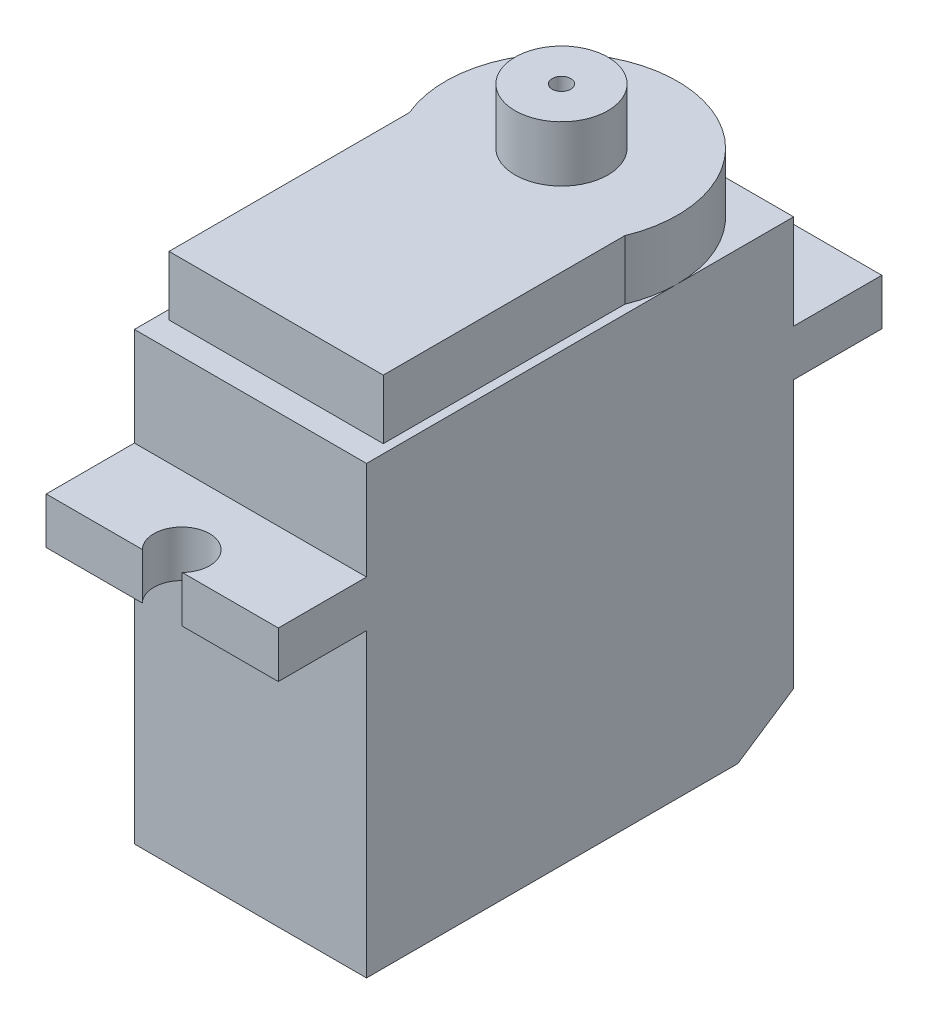
ISO-10303-21;
HEADER;
FILE_DESCRIPTION(('STEP AP214'),'2;1');
FILE_NAME('part.step','',(''),(''),'','','');
FILE_SCHEMA(('AUTOMOTIVE_DESIGN { 1 0 10303 214 1 1 1 1 }'));
ENDSEC;
DATA;
#1=APPLICATION_CONTEXT('core data for automotive mechanical design processes');
#2=APPLICATION_PROTOCOL_DEFINITION('international standard','automotive_design',2000,#1);
#3=PRODUCT_CONTEXT('',#1,'mechanical');
#4=PRODUCT('Part','Part','',(#3));
#5=PRODUCT_RELATED_PRODUCT_CATEGORY('part','',(#4));
#6=PRODUCT_DEFINITION_FORMATION('','',#4);
#7=PRODUCT_DEFINITION_CONTEXT('part definition',#1,'design');
#8=PRODUCT_DEFINITION('design','',#6,#7);
#9=PRODUCT_DEFINITION_SHAPE('','',#8);
#10=(LENGTH_UNIT() NAMED_UNIT(*) SI_UNIT(.MILLI.,.METRE.));
#11=(NAMED_UNIT(*) PLANE_ANGLE_UNIT() SI_UNIT($,.RADIAN.));
#12=(NAMED_UNIT(*) SI_UNIT($,.STERADIAN.) SOLID_ANGLE_UNIT());
#13=UNCERTAINTY_MEASURE_WITH_UNIT(LENGTH_MEASURE(1.E-05),#10,'distance_accuracy_value','');
#14=(GEOMETRIC_REPRESENTATION_CONTEXT(3) GLOBAL_UNCERTAINTY_ASSIGNED_CONTEXT((#13)) GLOBAL_UNIT_ASSIGNED_CONTEXT((#10,
#11,#12)) REPRESENTATION_CONTEXT('',''));
#15=CARTESIAN_POINT('',(0.,0.,0.));
#16=DIRECTION('',(0.,0.,1.));
#17=DIRECTION('',(1.,0.,0.));
#18=AXIS2_PLACEMENT_3D('',#15,#16,#17);
#19=CARTESIAN_POINT('',(0.,0.,-16.25));
#20=DIRECTION('',(0.,0.,-1.));
#21=DIRECTION('',(-1.,0.,0.));
#22=AXIS2_PLACEMENT_3D('',#19,#20,#21);
#23=PLANE('',#22);
#24=DIRECTION('',(0.,1.,0.));
#25=VECTOR('',#24,1.);
#26=CARTESIAN_POINT('',(-1.07121426428143,-0.001000000000001,-16.25));
#27=LINE('',#26,#25);
#28=CARTESIAN_POINT('',(-1.07121426428143,18.9,-16.25));
#29=VERTEX_POINT('',#28);
#30=CARTESIAN_POINT('',(-1.07121426428143,16.4,-16.25));
#31=VERTEX_POINT('',#30);
#32=EDGE_CURVE('E440',#29,#31,#27,.F.);
#33=ORIENTED_EDGE('',*,*,#32,.T.);
#34=DIRECTION('',(-1.,0.,0.));
#35=VECTOR('',#34,1.);
#36=CARTESIAN_POINT('',(6.25,16.4,-16.25));
#37=LINE('',#36,#35);
#38=CARTESIAN_POINT('',(-6.25,16.4,-16.25));
#39=VERTEX_POINT('',#38);
#40=EDGE_CURVE('E381',#31,#39,#37,.T.);
#41=ORIENTED_EDGE('',*,*,#40,.T.);
#42=DIRECTION('',(0.,1.,0.));
#43=VECTOR('',#42,1.);
#44=CARTESIAN_POINT('',(-6.25,18.9,-16.25));
#45=LINE('',#44,#43);
#46=CARTESIAN_POINT('',(-6.25,18.9,-16.25));
#47=VERTEX_POINT('',#46);
#48=EDGE_CURVE('E374',#39,#47,#45,.T.);
#49=ORIENTED_EDGE('',*,*,#48,.T.);
#50=DIRECTION('',(1.,0.,0.));
#51=VECTOR('',#50,1.);
#52=CARTESIAN_POINT('',(6.25,18.9,-16.25));
#53=LINE('',#52,#51);
#54=EDGE_CURVE('E360',#47,#29,#53,.T.);
#55=ORIENTED_EDGE('',*,*,#54,.T.);
#56=EDGE_LOOP('',(#33,#41,#49,#55));
#57=FACE_BOUND('',#56,.T.);
#58=ADVANCED_FACE('F49',(#57),#23,.T.);
#59=CARTESIAN_POINT('',(0.,0.,16.25));
#60=DIRECTION('',(0.,0.,1.));
#61=DIRECTION('',(1.,0.,0.));
#62=AXIS2_PLACEMENT_3D('',#59,#60,#61);
#63=PLANE('',#62);
#64=DIRECTION('',(0.,1.,0.));
#65=VECTOR('',#64,1.);
#66=CARTESIAN_POINT('',(1.07121426428143,-0.001000000000001,16.25));
#67=LINE('',#66,#65);
#68=CARTESIAN_POINT('',(1.07121426428143,18.7,16.25));
#69=VERTEX_POINT('',#68);
#70=CARTESIAN_POINT('',(1.07121426428143,16.2,16.25));
#71=VERTEX_POINT('',#70);
#72=EDGE_CURVE('E427',#69,#71,#67,.F.);
#73=ORIENTED_EDGE('',*,*,#72,.T.);
#74=DIRECTION('',(1.,0.,0.));
#75=VECTOR('',#74,1.);
#76=CARTESIAN_POINT('',(6.25,16.2,16.25));
#77=LINE('',#76,#75);
#78=CARTESIAN_POINT('',(6.25,16.2,16.25));
#79=VERTEX_POINT('',#78);
#80=EDGE_CURVE('E410',#71,#79,#77,.T.);
#81=ORIENTED_EDGE('',*,*,#80,.T.);
#82=DIRECTION('',(0.,1.,0.));
#83=VECTOR('',#82,1.);
#84=CARTESIAN_POINT('',(6.25,16.2,16.25));
#85=LINE('',#84,#83);
#86=CARTESIAN_POINT('',(6.25,18.7,16.25));
#87=VERTEX_POINT('',#86);
#88=EDGE_CURVE('E402',#79,#87,#85,.T.);
#89=ORIENTED_EDGE('',*,*,#88,.T.);
#90=DIRECTION('',(-1.,0.,0.));
#91=VECTOR('',#90,1.);
#92=CARTESIAN_POINT('',(6.25,18.7,16.25));
#93=LINE('',#92,#91);
#94=EDGE_CURVE('E414',#87,#69,#93,.T.);
#95=ORIENTED_EDGE('',*,*,#94,.T.);
#96=EDGE_LOOP('',(#73,#81,#89,#95));
#97=FACE_BOUND('',#96,.T.);
#98=ADVANCED_FACE('F528',(#97),#63,.T.);
#99=CARTESIAN_POINT('',(-6.25,24.,11.5));
#100=DIRECTION('',(0.,0.,-1.));
#101=DIRECTION('',(-1.,0.,0.));
#102=AXIS2_PLACEMENT_3D('',#99,#100,#101);
#103=PLANE('',#102);
#104=DIRECTION('',(1.,0.,0.));
#105=VECTOR('',#104,1.);
#106=CARTESIAN_POINT('',(6.25,16.2,11.5));
#107=LINE('',#106,#105);
#108=CARTESIAN_POINT('',(-6.25,16.2,11.5));
#109=VERTEX_POINT('',#108);
#110=CARTESIAN_POINT('',(6.25,16.2,11.5));
#111=VERTEX_POINT('',#110);
#112=EDGE_CURVE('E267',#109,#111,#107,.T.);
#113=ORIENTED_EDGE('',*,*,#112,.F.);
#114=DIRECTION('',(0.,-1.,0.));
#115=VECTOR('',#114,1.);
#116=CARTESIAN_POINT('',(-6.25,24.,11.5));
#117=LINE('',#116,#115);
#118=CARTESIAN_POINT('',(-6.25,0.,11.5));
#119=VERTEX_POINT('',#118);
#120=EDGE_CURVE('E244',#109,#119,#117,.T.);
#121=ORIENTED_EDGE('',*,*,#120,.T.);
#122=DIRECTION('',(1.,0.,0.));
#123=VECTOR('',#122,1.);
#124=CARTESIAN_POINT('',(-6.25,0.,11.5));
#125=LINE('',#124,#123);
#126=CARTESIAN_POINT('',(6.25,0.,11.5));
#127=VERTEX_POINT('',#126);
#128=EDGE_CURVE('E264',#119,#127,#125,.T.);
#129=ORIENTED_EDGE('',*,*,#128,.T.);
#130=DIRECTION('',(0.,-1.,0.));
#131=VECTOR('',#130,1.);
#132=CARTESIAN_POINT('',(6.25,24.,11.5));
#133=LINE('',#132,#131);
#134=EDGE_CURVE('E240',#111,#127,#133,.T.);
#135=ORIENTED_EDGE('',*,*,#134,.F.);
#136=EDGE_LOOP('',(#113,#121,#129,#135));
#137=FACE_BOUND('',#136,.T.);
#138=ADVANCED_FACE('F263',(#137),#103,.F.);
#139=DIRECTION('',(-1.,0.,0.));
#140=VECTOR('',#139,1.);
#141=CARTESIAN_POINT('',(6.25,18.7,11.5));
#142=LINE('',#141,#140);
#143=CARTESIAN_POINT('',(6.25,18.7,11.5));
#144=VERTEX_POINT('',#143);
#145=CARTESIAN_POINT('',(-6.25,18.7,11.5));
#146=VERTEX_POINT('',#145);
#147=EDGE_CURVE('E403',#144,#146,#142,.T.);
#148=ORIENTED_EDGE('',*,*,#147,.F.);
#149=CARTESIAN_POINT('',(6.25,24.,11.5));
#150=VERTEX_POINT('',#149);
#151=EDGE_CURVE('E241',#150,#144,#133,.T.);
#152=ORIENTED_EDGE('',*,*,#151,.F.);
#153=DIRECTION('',(1.,0.,0.));
#154=VECTOR('',#153,1.);
#155=CARTESIAN_POINT('',(-6.25,24.,11.5));
#156=LINE('',#155,#154);
#157=CARTESIAN_POINT('',(-6.25,24.,11.5));
#158=VERTEX_POINT('',#157);
#159=EDGE_CURVE('E286',#158,#150,#156,.T.);
#160=ORIENTED_EDGE('',*,*,#159,.F.);
#161=EDGE_CURVE('E245',#158,#146,#117,.T.);
#162=ORIENTED_EDGE('',*,*,#161,.T.);
#163=EDGE_LOOP('',(#148,#152,#160,#162));
#164=FACE_BOUND('',#163,.T.);
#165=ADVANCED_FACE('F643',(#164),#103,.F.);
#166=CARTESIAN_POINT('',(-6.25,24.,-11.5));
#167=DIRECTION('',(0.,0.,1.));
#168=DIRECTION('',(1.,0.,0.));
#169=AXIS2_PLACEMENT_3D('',#166,#167,#168);
#170=PLANE('',#169);
#171=DIRECTION('',(0.,-1.,0.));
#172=VECTOR('',#171,1.);
#173=CARTESIAN_POINT('',(6.25,24.,-11.5));
#174=LINE('',#173,#172);
#175=CARTESIAN_POINT('',(6.25,16.4,-11.5));
#176=VERTEX_POINT('',#175);
#177=CARTESIAN_POINT('',(6.25,2.,-11.5));
#178=VERTEX_POINT('',#177);
#179=EDGE_CURVE('E216',#176,#178,#174,.T.);
#180=ORIENTED_EDGE('',*,*,#179,.T.);
#181=DIRECTION('',(1.,0.,0.));
#182=VECTOR('',#181,1.);
#183=CARTESIAN_POINT('',(-6.25000000000001,2.,-11.5));
#184=LINE('',#183,#182);
#185=CARTESIAN_POINT('',(-6.25000000000001,2.,-11.5));
#186=VERTEX_POINT('',#185);
#187=EDGE_CURVE('E203',#186,#178,#184,.T.);
#188=ORIENTED_EDGE('',*,*,#187,.F.);
#189=DIRECTION('',(0.,-1.,0.));
#190=VECTOR('',#189,1.);
#191=CARTESIAN_POINT('',(-6.25,24.,-11.5));
#192=LINE('',#191,#190);
#193=CARTESIAN_POINT('',(-6.25,16.4,-11.5));
#194=VERTEX_POINT('',#193);
#195=EDGE_CURVE('E213',#194,#186,#192,.T.);
#196=ORIENTED_EDGE('',*,*,#195,.F.);
#197=DIRECTION('',(-1.,0.,0.));
#198=VECTOR('',#197,1.);
#199=CARTESIAN_POINT('',(6.25,16.4,-11.5));
#200=LINE('',#199,#198);
#201=EDGE_CURVE('E366',#176,#194,#200,.T.);
#202=ORIENTED_EDGE('',*,*,#201,.F.);
#203=EDGE_LOOP('',(#180,#188,#196,#202));
#204=FACE_BOUND('',#203,.T.);
#205=ADVANCED_FACE('F212',(#204),#170,.F.);
#206=DIRECTION('',(1.,0.,0.));
#207=VECTOR('',#206,1.);
#208=CARTESIAN_POINT('',(6.25,18.9,-11.5));
#209=LINE('',#208,#207);
#210=CARTESIAN_POINT('',(-6.25,18.9,-11.5));
#211=VERTEX_POINT('',#210);
#212=CARTESIAN_POINT('',(6.25,18.9,-11.5));
#213=VERTEX_POINT('',#212);
#214=EDGE_CURVE('E361',#211,#213,#209,.T.);
#215=ORIENTED_EDGE('',*,*,#214,.F.);
#216=CARTESIAN_POINT('',(-6.25,24.,-11.5));
#217=VERTEX_POINT('',#216);
#218=EDGE_CURVE('E224',#217,#211,#192,.T.);
#219=ORIENTED_EDGE('',*,*,#218,.F.);
#220=DIRECTION('',(-1.,0.,0.));
#221=VECTOR('',#220,1.);
#222=CARTESIAN_POINT('',(-6.25,24.,-11.5));
#223=LINE('',#222,#221);
#224=CARTESIAN_POINT('',(0.,24.,-11.5));
#225=VERTEX_POINT('',#224);
#226=EDGE_CURVE('E231',#225,#217,#223,.T.);
#227=ORIENTED_EDGE('',*,*,#226,.F.);
#228=CARTESIAN_POINT('',(6.25,24.,-11.5));
#229=VERTEX_POINT('',#228);
#230=EDGE_CURVE('E225',#229,#225,#223,.T.);
#231=ORIENTED_EDGE('',*,*,#230,.F.);
#232=EDGE_CURVE('E237',#229,#213,#174,.T.);
#233=ORIENTED_EDGE('',*,*,#232,.T.);
#234=EDGE_LOOP('',(#215,#219,#227,#231,#233));
#235=FACE_BOUND('',#234,.T.);
#236=ADVANCED_FACE('F478',(#235),#170,.F.);
#237=CARTESIAN_POINT('',(0.,24.,0.));
#238=DIRECTION('',(0.,1.,0.));
#239=DIRECTION('',(0.,0.,1.));
#240=AXIS2_PLACEMENT_3D('',#237,#238,#239);
#241=PLANE('',#240);
#242=CARTESIAN_POINT('',(0.,24.,-5.24999999999999));
#243=DIRECTION('',(0.,1.,0.));
#244=DIRECTION('',(0.,0.,1.));
#245=AXIS2_PLACEMENT_3D('',#242,#243,#244);
#246=CIRCLE('',#245,6.25);
#247=CARTESIAN_POINT('',(5.78168855170607,24.,-2.87627350120722));
#248=VERTEX_POINT('',#247);
#249=CARTESIAN_POINT('',(6.25,24.,-5.25));
#250=VERTEX_POINT('',#249);
#251=EDGE_CURVE('E257',#248,#250,#246,.T.);
#252=ORIENTED_EDGE('',*,*,#251,.F.);
#253=DIRECTION('',(0.,0.,1.));
#254=VECTOR('',#253,1.);
#255=CARTESIAN_POINT('',(5.78168855170607,24.,-2.87627350120722));
#256=LINE('',#255,#254);
#257=CARTESIAN_POINT('',(5.78168855170607,24.,10.1288199195989));
#258=VERTEX_POINT('',#257);
#259=EDGE_CURVE('E320',#248,#258,#256,.T.);
#260=ORIENTED_EDGE('',*,*,#259,.T.);
#261=DIRECTION('',(1.,0.,0.));
#262=VECTOR('',#261,1.);
#263=CARTESIAN_POINT('',(-5.75762102355062,24.,10.1288199195989));
#264=LINE('',#263,#262);
#265=CARTESIAN_POINT('',(-5.75762102355062,24.,10.1288199195989));
#266=VERTEX_POINT('',#265);
#267=EDGE_CURVE('E316',#266,#258,#264,.T.);
#268=ORIENTED_EDGE('',*,*,#267,.F.);
#269=DIRECTION('',(0.,0.,1.));
#270=VECTOR('',#269,1.);
#271=CARTESIAN_POINT('',(-5.75762102355062,24.,-2.81847781232252));
#272=LINE('',#271,#270);
#273=CARTESIAN_POINT('',(-5.75762102355063,24.,-2.81847781232252));
#274=VERTEX_POINT('',#273);
#275=EDGE_CURVE('E312',#274,#266,#272,.T.);
#276=ORIENTED_EDGE('',*,*,#275,.F.);
#277=CARTESIAN_POINT('',(-6.25,24.,-5.24999999999999));
#278=VERTEX_POINT('',#277);
#279=EDGE_CURVE('E247',#278,#274,#246,.T.);
#280=ORIENTED_EDGE('',*,*,#279,.F.);
#281=DIRECTION('',(0.,0.,1.));
#282=VECTOR('',#281,1.);
#283=CARTESIAN_POINT('',(-6.25,24.,-11.5));
#284=LINE('',#283,#282);
#285=EDGE_CURVE('E277',#278,#158,#284,.T.);
#286=ORIENTED_EDGE('',*,*,#285,.T.);
#287=ORIENTED_EDGE('',*,*,#159,.T.);
#288=DIRECTION('',(0.,0.,-1.));
#289=VECTOR('',#288,1.);
#290=CARTESIAN_POINT('',(6.25,24.,-11.5));
#291=LINE('',#290,#289);
#292=EDGE_CURVE('E281',#150,#250,#291,.T.);
#293=ORIENTED_EDGE('',*,*,#292,.T.);
#294=EDGE_LOOP('',(#252,#260,#268,#276,#280,#286,#287,#293));
#295=FACE_BOUND('',#294,.T.);
#296=ADVANCED_FACE('F485',(#295),#241,.T.);
#297=EDGE_CURVE('E58',#250,#225,#246,.T.);
#298=ORIENTED_EDGE('',*,*,#297,.F.);
#299=EDGE_CURVE('E285',#250,#229,#291,.T.);
#300=ORIENTED_EDGE('',*,*,#299,.T.);
#301=ORIENTED_EDGE('',*,*,#230,.T.);
#302=EDGE_LOOP('',(#298,#300,#301));
#303=FACE_BOUND('',#302,.T.);
#304=ADVANCED_FACE('F515',(#303),#241,.T.);
#305=CARTESIAN_POINT('',(-6.25,24.,-11.5));
#306=DIRECTION('',(1.,0.,0.));
#307=DIRECTION('',(0.,0.,-1.));
#308=AXIS2_PLACEMENT_3D('',#305,#306,#307);
#309=PLANE('',#308);
#310=ORIENTED_EDGE('',*,*,#195,.T.);
#311=DIRECTION('',(0.,-0.554700196225229,0.832050294337844));
#312=VECTOR('',#311,1.);
#313=CARTESIAN_POINT('',(-6.25000000000001,2.,-11.5));
#314=LINE('',#313,#312);
#315=CARTESIAN_POINT('',(-6.25000000000001,0.,-8.49999999999999));
#316=VERTEX_POINT('',#315);
#317=EDGE_CURVE('E200',#186,#316,#314,.T.);
#318=ORIENTED_EDGE('',*,*,#317,.T.);
#319=DIRECTION('',(0.,0.,1.));
#320=VECTOR('',#319,1.);
#321=CARTESIAN_POINT('',(-6.25,0.,-11.5));
#322=LINE('',#321,#320);
#323=EDGE_CURVE('E272',#316,#119,#322,.T.);
#324=ORIENTED_EDGE('',*,*,#323,.T.);
#325=ORIENTED_EDGE('',*,*,#120,.F.);
#326=DIRECTION('',(0.,0.,-1.));
#327=VECTOR('',#326,1.);
#328=CARTESIAN_POINT('',(-6.25,16.2,16.25));
#329=LINE('',#328,#327);
#330=CARTESIAN_POINT('',(-6.25,16.2,16.25));
#331=VERTEX_POINT('',#330);
#332=EDGE_CURVE('E392',#331,#109,#329,.T.);
#333=ORIENTED_EDGE('',*,*,#332,.F.);
#334=DIRECTION('',(0.,-1.,0.));
#335=VECTOR('',#334,1.);
#336=CARTESIAN_POINT('',(-6.25,16.2,16.25));
#337=LINE('',#336,#335);
#338=CARTESIAN_POINT('',(-6.25,18.7,16.25));
#339=VERTEX_POINT('',#338);
#340=EDGE_CURVE('E411',#339,#331,#337,.T.);
#341=ORIENTED_EDGE('',*,*,#340,.F.);
#342=DIRECTION('',(0.,0.,-1.));
#343=VECTOR('',#342,1.);
#344=CARTESIAN_POINT('',(-6.25,18.7,16.25));
#345=LINE('',#344,#343);
#346=EDGE_CURVE('E388',#339,#146,#345,.T.);
#347=ORIENTED_EDGE('',*,*,#346,.T.);
#348=ORIENTED_EDGE('',*,*,#161,.F.);
#349=ORIENTED_EDGE('',*,*,#285,.F.);
#350=EDGE_CURVE('E289',#217,#278,#284,.T.);
#351=ORIENTED_EDGE('',*,*,#350,.F.);
#352=ORIENTED_EDGE('',*,*,#218,.T.);
#353=DIRECTION('',(0.,0.,1.));
#354=VECTOR('',#353,1.);
#355=CARTESIAN_POINT('',(-6.25,18.9,-16.25));
#356=LINE('',#355,#354);
#357=EDGE_CURVE('E352',#47,#211,#356,.T.);
#358=ORIENTED_EDGE('',*,*,#357,.F.);
#359=ORIENTED_EDGE('',*,*,#48,.F.);
#360=DIRECTION('',(0.,0.,1.));
#361=VECTOR('',#360,1.);
#362=CARTESIAN_POINT('',(-6.25,16.4,-16.25));
#363=LINE('',#362,#361);
#364=EDGE_CURVE('E222',#39,#194,#363,.T.);
#365=ORIENTED_EDGE('',*,*,#364,.T.);
#366=EDGE_LOOP('',(#310,#318,#324,#325,#333,#341,#347,#348,#349,#351,#352,#358,#359,#365));
#367=FACE_BOUND('',#366,.T.);
#368=ADVANCED_FACE('F51',(#367),#309,.F.);
#369=CARTESIAN_POINT('',(6.25,24.,-11.5));
#370=DIRECTION('',(-1.,0.,0.));
#371=DIRECTION('',(0.,0.,1.));
#372=AXIS2_PLACEMENT_3D('',#369,#370,#371);
#373=PLANE('',#372);
#374=DIRECTION('',(0.,0.,-1.));
#375=VECTOR('',#374,1.);
#376=CARTESIAN_POINT('',(6.25,0.,-11.5));
#377=LINE('',#376,#375);
#378=CARTESIAN_POINT('',(6.25,0.,-8.49999999999999));
#379=VERTEX_POINT('',#378);
#380=EDGE_CURVE('E235',#127,#379,#377,.T.);
#381=ORIENTED_EDGE('',*,*,#380,.T.);
#382=DIRECTION('',(0.,-0.554700196225229,0.832050294337844));
#383=VECTOR('',#382,1.);
#384=CARTESIAN_POINT('',(6.25,2.,-11.5));
#385=LINE('',#384,#383);
#386=EDGE_CURVE('E65',#178,#379,#385,.T.);
#387=ORIENTED_EDGE('',*,*,#386,.F.);
#388=ORIENTED_EDGE('',*,*,#179,.F.);
#389=DIRECTION('',(0.,0.,1.));
#390=VECTOR('',#389,1.);
#391=CARTESIAN_POINT('',(6.25,16.4,-16.25));
#392=LINE('',#391,#390);
#393=CARTESIAN_POINT('',(6.25,16.4,-16.25));
#394=VERTEX_POINT('',#393);
#395=EDGE_CURVE('E346',#394,#176,#392,.T.);
#396=ORIENTED_EDGE('',*,*,#395,.F.);
#397=DIRECTION('',(0.,-1.,0.));
#398=VECTOR('',#397,1.);
#399=CARTESIAN_POINT('',(6.25,18.9,-16.25));
#400=LINE('',#399,#398);
#401=CARTESIAN_POINT('',(6.25,18.9,-16.25));
#402=VERTEX_POINT('',#401);
#403=EDGE_CURVE('E365',#402,#394,#400,.T.);
#404=ORIENTED_EDGE('',*,*,#403,.F.);
#405=DIRECTION('',(0.,0.,1.));
#406=VECTOR('',#405,1.);
#407=CARTESIAN_POINT('',(6.25,18.9,-16.25));
#408=LINE('',#407,#406);
#409=EDGE_CURVE('E356',#402,#213,#408,.T.);
#410=ORIENTED_EDGE('',*,*,#409,.T.);
#411=ORIENTED_EDGE('',*,*,#232,.F.);
#412=ORIENTED_EDGE('',*,*,#299,.F.);
#413=ORIENTED_EDGE('',*,*,#292,.F.);
#414=ORIENTED_EDGE('',*,*,#151,.T.);
#415=DIRECTION('',(0.,0.,-1.));
#416=VECTOR('',#415,1.);
#417=CARTESIAN_POINT('',(6.25,18.7,16.25));
#418=LINE('',#417,#416);
#419=EDGE_CURVE('E369',#87,#144,#418,.T.);
#420=ORIENTED_EDGE('',*,*,#419,.F.);
#421=ORIENTED_EDGE('',*,*,#88,.F.);
#422=DIRECTION('',(0.,0.,-1.));
#423=VECTOR('',#422,1.);
#424=CARTESIAN_POINT('',(6.25,16.2,16.25));
#425=LINE('',#424,#423);
#426=EDGE_CURVE('E395',#79,#111,#425,.T.);
#427=ORIENTED_EDGE('',*,*,#426,.T.);
#428=ORIENTED_EDGE('',*,*,#134,.T.);
#429=EDGE_LOOP('',(#381,#387,#388,#396,#404,#410,#411,#412,#413,#414,#420,#421,#427,#428));
#430=FACE_BOUND('',#429,.T.);
#431=ADVANCED_FACE('F464',(#430),#373,.F.);
#432=EDGE_CURVE('E255',#225,#278,#246,.T.);
#433=ORIENTED_EDGE('',*,*,#432,.F.);
#434=ORIENTED_EDGE('',*,*,#226,.T.);
#435=ORIENTED_EDGE('',*,*,#350,.T.);
#436=EDGE_LOOP('',(#433,#434,#435));
#437=FACE_BOUND('',#436,.T.);
#438=ADVANCED_FACE('F509',(#437),#241,.T.);
#439=CARTESIAN_POINT('',(0.,0.,0.));
#440=DIRECTION('',(0.,1.,0.));
#441=DIRECTION('',(0.,0.,1.));
#442=AXIS2_PLACEMENT_3D('',#439,#440,#441);
#443=PLANE('',#442);
#444=ORIENTED_EDGE('',*,*,#323,.F.);
#445=DIRECTION('',(1.,0.,0.));
#446=VECTOR('',#445,1.);
#447=CARTESIAN_POINT('',(-6.25000000000001,0.,-8.49999999999999));
#448=LINE('',#447,#446);
#449=EDGE_CURVE('E204',#316,#379,#448,.T.);
#450=ORIENTED_EDGE('',*,*,#449,.T.);
#451=ORIENTED_EDGE('',*,*,#380,.F.);
#452=ORIENTED_EDGE('',*,*,#128,.F.);
#453=EDGE_LOOP('',(#444,#450,#451,#452));
#454=FACE_BOUND('',#453,.T.);
#455=ADVANCED_FACE('F271',(#454),#443,.F.);
#456=CARTESIAN_POINT('',(5.78168855170607,27.2,-2.87627350120722));
#457=DIRECTION('',(1.,0.,0.));
#458=DIRECTION('',(0.,0.,-1.));
#459=AXIS2_PLACEMENT_3D('',#456,#457,#458);
#460=PLANE('',#459);
#461=ORIENTED_EDGE('',*,*,#259,.F.);
#462=DIRECTION('',(0.,-1.,0.));
#463=VECTOR('',#462,1.);
#464=CARTESIAN_POINT('',(5.78168855170607,27.2,-2.87627350120722));
#465=LINE('',#464,#463);
#466=CARTESIAN_POINT('',(5.78168855170607,27.2,-2.87627350120722));
#467=VERTEX_POINT('',#466);
#468=EDGE_CURVE('E278',#467,#248,#465,.T.);
#469=ORIENTED_EDGE('',*,*,#468,.F.);
#470=DIRECTION('',(0.,0.,1.));
#471=VECTOR('',#470,1.);
#472=CARTESIAN_POINT('',(5.78168855170607,27.2,-2.87627350120722));
#473=LINE('',#472,#471);
#474=CARTESIAN_POINT('',(5.78168855170607,27.2,10.1288199195989));
#475=VERTEX_POINT('',#474);
#476=EDGE_CURVE('E311',#467,#475,#473,.T.);
#477=ORIENTED_EDGE('',*,*,#476,.T.);
#478=DIRECTION('',(0.,-1.,0.));
#479=VECTOR('',#478,1.);
#480=CARTESIAN_POINT('',(5.78168855170607,27.2,10.1288199195989));
#481=LINE('',#480,#479);
#482=EDGE_CURVE('E293',#475,#258,#481,.T.);
#483=ORIENTED_EDGE('',*,*,#482,.T.);
#484=EDGE_LOOP('',(#461,#469,#477,#483));
#485=FACE_BOUND('',#484,.T.);
#486=ADVANCED_FACE('F496',(#485),#460,.T.);
#487=CARTESIAN_POINT('',(0.,27.2,-5.24999999999999));
#488=DIRECTION('',(0.,-1.,0.));
#489=DIRECTION('',(0.,0.,-1.));
#490=AXIS2_PLACEMENT_3D('',#487,#488,#489);
#491=CYLINDRICAL_SURFACE('',#490,6.25);
#492=ORIENTED_EDGE('',*,*,#251,.T.);
#493=ORIENTED_EDGE('',*,*,#297,.T.);
#494=ORIENTED_EDGE('',*,*,#432,.T.);
#495=ORIENTED_EDGE('',*,*,#279,.T.);
#496=DIRECTION('',(0.,-1.,0.));
#497=VECTOR('',#496,1.);
#498=CARTESIAN_POINT('',(-5.75762102355063,27.2,-2.81847781232252));
#499=LINE('',#498,#497);
#500=CARTESIAN_POINT('',(-5.75762102355063,27.2,-2.81847781232252));
#501=VERTEX_POINT('',#500);
#502=EDGE_CURVE('E302',#501,#274,#499,.T.);
#503=ORIENTED_EDGE('',*,*,#502,.F.);
#504=CARTESIAN_POINT('',(0.,27.2,-5.24999999999999));
#505=DIRECTION('',(0.,1.,0.));
#506=DIRECTION('',(0.,0.,1.));
#507=AXIS2_PLACEMENT_3D('',#504,#505,#506);
#508=CIRCLE('',#507,6.25);
#509=EDGE_CURVE('E298',#467,#501,#508,.T.);
#510=ORIENTED_EDGE('',*,*,#509,.F.);
#511=ORIENTED_EDGE('',*,*,#468,.T.);
#512=EDGE_LOOP('',(#492,#493,#494,#495,#503,#510,#511));
#513=FACE_BOUND('',#512,.T.);
#514=ADVANCED_FACE('F489',(#513),#491,.T.);
#515=CARTESIAN_POINT('',(-5.75762102355062,27.2,-2.81847781232252));
#516=DIRECTION('',(1.,0.,0.));
#517=DIRECTION('',(0.,0.,-1.));
#518=AXIS2_PLACEMENT_3D('',#515,#516,#517);
#519=PLANE('',#518);
#520=ORIENTED_EDGE('',*,*,#275,.T.);
#521=DIRECTION('',(0.,-1.,0.));
#522=VECTOR('',#521,1.);
#523=CARTESIAN_POINT('',(-5.75762102355062,27.2,10.1288199195989));
#524=LINE('',#523,#522);
#525=CARTESIAN_POINT('',(-5.75762102355062,27.2,10.1288199195989));
#526=VERTEX_POINT('',#525);
#527=EDGE_CURVE('E297',#526,#266,#524,.T.);
#528=ORIENTED_EDGE('',*,*,#527,.F.);
#529=DIRECTION('',(0.,0.,1.));
#530=VECTOR('',#529,1.);
#531=CARTESIAN_POINT('',(-5.75762102355062,27.2,-2.81847781232252));
#532=LINE('',#531,#530);
#533=EDGE_CURVE('E326',#501,#526,#532,.T.);
#534=ORIENTED_EDGE('',*,*,#533,.F.);
#535=ORIENTED_EDGE('',*,*,#502,.T.);
#536=EDGE_LOOP('',(#520,#528,#534,#535));
#537=FACE_BOUND('',#536,.T.);
#538=ADVANCED_FACE('F501',(#537),#519,.F.);
#539=CARTESIAN_POINT('',(-5.75762102355062,27.2,10.1288199195989));
#540=DIRECTION('',(0.,0.,-1.));
#541=DIRECTION('',(-1.,0.,0.));
#542=AXIS2_PLACEMENT_3D('',#539,#540,#541);
#543=PLANE('',#542);
#544=ORIENTED_EDGE('',*,*,#267,.T.);
#545=ORIENTED_EDGE('',*,*,#482,.F.);
#546=DIRECTION('',(1.,0.,0.));
#547=VECTOR('',#546,1.);
#548=CARTESIAN_POINT('',(-5.75762102355062,27.2,10.1288199195989));
#549=LINE('',#548,#547);
#550=EDGE_CURVE('E329',#526,#475,#549,.T.);
#551=ORIENTED_EDGE('',*,*,#550,.F.);
#552=ORIENTED_EDGE('',*,*,#527,.T.);
#553=EDGE_LOOP('',(#544,#545,#551,#552));
#554=FACE_BOUND('',#553,.T.);
#555=ADVANCED_FACE('F504',(#554),#543,.F.);
#556=CARTESIAN_POINT('',(0.,27.2,-5.24999999999999));
#557=DIRECTION('',(0.,1.,0.));
#558=DIRECTION('',(0.,0.,1.));
#559=AXIS2_PLACEMENT_3D('',#556,#557,#558);
#560=PLANE('',#559);
#561=CARTESIAN_POINT('',(0.,27.2,-5.24999999999999));
#562=DIRECTION('',(0.,1.,0.));
#563=DIRECTION('',(0.,0.,1.));
#564=AXIS2_PLACEMENT_3D('',#561,#562,#563);
#565=CIRCLE('',#564,2.5);
#566=CARTESIAN_POINT('',(0.,27.2,-2.74999999999999));
#567=VERTEX_POINT('',#566);
#568=EDGE_CURVE('E335',#567,#567,#565,.T.);
#569=ORIENTED_EDGE('',*,*,#568,.F.);
#570=EDGE_LOOP('',(#569));
#571=FACE_BOUND('',#570,.T.);
#572=ORIENTED_EDGE('',*,*,#476,.F.);
#573=ORIENTED_EDGE('',*,*,#509,.T.);
#574=ORIENTED_EDGE('',*,*,#533,.T.);
#575=ORIENTED_EDGE('',*,*,#550,.T.);
#576=EDGE_LOOP('',(#572,#573,#574,#575));
#577=FACE_BOUND('',#576,.T.);
#578=ADVANCED_FACE('F506',(#571,#577),#560,.T.);
#579=CARTESIAN_POINT('',(0.,30.2,-5.24999999999999));
#580=DIRECTION('',(0.,1.,0.));
#581=DIRECTION('',(0.,0.,1.));
#582=AXIS2_PLACEMENT_3D('',#579,#580,#581);
#583=PLANE('',#582);
#584=CARTESIAN_POINT('',(0.,30.2,-5.24999999999999));
#585=DIRECTION('',(0.,1.,0.));
#586=DIRECTION('',(0.,0.,1.));
#587=AXIS2_PLACEMENT_3D('',#584,#585,#586);
#588=CIRCLE('',#587,2.5);
#589=CARTESIAN_POINT('',(0.,30.2,-2.74999999999999));
#590=VERTEX_POINT('',#589);
#591=EDGE_CURVE('E323',#590,#590,#588,.T.);
#592=ORIENTED_EDGE('',*,*,#591,.T.);
#593=EDGE_LOOP('',(#592));
#594=FACE_BOUND('',#593,.T.);
#595=CARTESIAN_POINT('',(0.,30.2,-5.24999999999999));
#596=DIRECTION('',(0.,1.,0.));
#597=DIRECTION('',(0.,0.,1.));
#598=AXIS2_PLACEMENT_3D('',#595,#596,#597);
#599=CIRCLE('',#598,0.5);
#600=CARTESIAN_POINT('',(0.,30.2,-4.74999999999999));
#601=VERTEX_POINT('',#600);
#602=EDGE_CURVE('E339',#601,#601,#599,.T.);
#603=ORIENTED_EDGE('',*,*,#602,.F.);
#604=EDGE_LOOP('',(#603));
#605=FACE_BOUND('',#604,.T.);
#606=ADVANCED_FACE('F560',(#594,#605),#583,.T.);
#607=CARTESIAN_POINT('',(0.,30.2,-5.24999999999999));
#608=DIRECTION('',(0.,-1.,0.));
#609=DIRECTION('',(0.,0.,-1.));
#610=AXIS2_PLACEMENT_3D('',#607,#608,#609);
#611=CYLINDRICAL_SURFACE('',#610,2.5);
#612=ORIENTED_EDGE('',*,*,#591,.F.);
#613=EDGE_LOOP('',(#612));
#614=FACE_BOUND('',#613,.T.);
#615=ORIENTED_EDGE('',*,*,#568,.T.);
#616=EDGE_LOOP('',(#615));
#617=FACE_BOUND('',#616,.T.);
#618=ADVANCED_FACE('F558',(#614,#617),#611,.T.);
#619=CARTESIAN_POINT('',(0.,30.2,-5.24999999999999));
#620=DIRECTION('',(0.,-1.,0.));
#621=DIRECTION('',(0.,0.,-1.));
#622=AXIS2_PLACEMENT_3D('',#619,#620,#621);
#623=CYLINDRICAL_SURFACE('',#622,0.5);
#624=ORIENTED_EDGE('',*,*,#602,.T.);
#625=EDGE_LOOP('',(#624));
#626=FACE_BOUND('',#625,.T.);
#627=CARTESIAN_POINT('',(0.,27.2,-5.24999999999999));
#628=DIRECTION('',(0.,1.,0.));
#629=DIRECTION('',(0.,0.,1.));
#630=AXIS2_PLACEMENT_3D('',#627,#628,#629);
#631=CIRCLE('',#630,0.5);
#632=CARTESIAN_POINT('',(0.,27.2,-4.74999999999999));
#633=VERTEX_POINT('',#632);
#634=EDGE_CURVE('E11',#633,#633,#631,.F.);
#635=ORIENTED_EDGE('',*,*,#634,.T.);
#636=EDGE_LOOP('',(#635));
#637=FACE_BOUND('',#636,.T.);
#638=ADVANCED_FACE('F555',(#626,#637),#623,.F.);
#639=ORIENTED_EDGE('',*,*,#634,.F.);
#640=EDGE_LOOP('',(#639));
#641=FACE_BOUND('',#640,.T.);
#642=ADVANCED_FACE('F552',(#641),#560,.T.);
#643=CARTESIAN_POINT('',(6.25,16.4,-16.25));
#644=DIRECTION('',(0.,1.,0.));
#645=DIRECTION('',(0.,0.,1.));
#646=AXIS2_PLACEMENT_3D('',#643,#644,#645);
#647=PLANE('',#646);
#648=ORIENTED_EDGE('',*,*,#40,.F.);
#649=CARTESIAN_POINT('',(0.,16.4,-15.2));
#650=DIRECTION('',(0.,1.,0.));
#651=DIRECTION('',(0.,0.,1.));
#652=AXIS2_PLACEMENT_3D('',#649,#650,#651);
#653=CIRCLE('',#652,1.5);
#654=CARTESIAN_POINT('',(1.07121426428143,16.4,-16.25));
#655=VERTEX_POINT('',#654);
#656=EDGE_CURVE('E435',#655,#31,#653,.F.);
#657=ORIENTED_EDGE('',*,*,#656,.F.);
#658=EDGE_CURVE('E377',#394,#655,#37,.T.);
#659=ORIENTED_EDGE('',*,*,#658,.F.);
#660=ORIENTED_EDGE('',*,*,#395,.T.);
#661=ORIENTED_EDGE('',*,*,#201,.T.);
#662=ORIENTED_EDGE('',*,*,#364,.F.);
#663=EDGE_LOOP('',(#648,#657,#659,#660,#661,#662));
#664=FACE_BOUND('',#663,.T.);
#665=ADVANCED_FACE('F467',(#664),#647,.F.);
#666=CARTESIAN_POINT('',(6.25,18.9,-16.25));
#667=DIRECTION('',(0.,-1.,0.));
#668=DIRECTION('',(0.,0.,-1.));
#669=AXIS2_PLACEMENT_3D('',#666,#667,#668);
#670=PLANE('',#669);
#671=CARTESIAN_POINT('',(1.07121426428143,18.9,-16.25));
#672=VERTEX_POINT('',#671);
#673=EDGE_CURVE('E373',#672,#402,#53,.T.);
#674=ORIENTED_EDGE('',*,*,#673,.F.);
#675=CARTESIAN_POINT('',(0.,18.9,-15.2));
#676=DIRECTION('',(0.,1.,0.));
#677=DIRECTION('',(0.,0.,1.));
#678=AXIS2_PLACEMENT_3D('',#675,#676,#677);
#679=CIRCLE('',#678,1.5);
#680=EDGE_CURVE('E73',#29,#672,#679,.T.);
#681=ORIENTED_EDGE('',*,*,#680,.F.);
#682=ORIENTED_EDGE('',*,*,#54,.F.);
#683=ORIENTED_EDGE('',*,*,#357,.T.);
#684=ORIENTED_EDGE('',*,*,#214,.T.);
#685=ORIENTED_EDGE('',*,*,#409,.F.);
#686=EDGE_LOOP('',(#674,#681,#682,#683,#684,#685));
#687=FACE_BOUND('',#686,.T.);
#688=ADVANCED_FACE('F461',(#687),#670,.F.);
#689=DIRECTION('',(0.,1.,0.));
#690=VECTOR('',#689,1.);
#691=CARTESIAN_POINT('',(1.07121426428143,-0.001000000000001,-16.25));
#692=LINE('',#691,#690);
#693=EDGE_CURVE('E444',#655,#672,#692,.T.);
#694=ORIENTED_EDGE('',*,*,#693,.T.);
#695=ORIENTED_EDGE('',*,*,#673,.T.);
#696=ORIENTED_EDGE('',*,*,#403,.T.);
#697=ORIENTED_EDGE('',*,*,#658,.T.);
#698=EDGE_LOOP('',(#694,#695,#696,#697));
#699=FACE_BOUND('',#698,.T.);
#700=ADVANCED_FACE('F457',(#699),#23,.T.);
#701=CARTESIAN_POINT('',(6.25,18.7,16.25));
#702=DIRECTION('',(0.,-1.,0.));
#703=DIRECTION('',(0.,0.,-1.));
#704=AXIS2_PLACEMENT_3D('',#701,#702,#703);
#705=PLANE('',#704);
#706=CARTESIAN_POINT('',(-1.07121426428142,18.7,16.25));
#707=VERTEX_POINT('',#706);
#708=EDGE_CURVE('E418',#707,#339,#93,.T.);
#709=ORIENTED_EDGE('',*,*,#708,.F.);
#710=CARTESIAN_POINT('',(0.,18.7,15.2));
#711=DIRECTION('',(0.,1.,0.));
#712=DIRECTION('',(0.,0.,1.));
#713=AXIS2_PLACEMENT_3D('',#710,#711,#712);
#714=CIRCLE('',#713,1.5);
#715=EDGE_CURVE('E424',#69,#707,#714,.T.);
#716=ORIENTED_EDGE('',*,*,#715,.F.);
#717=ORIENTED_EDGE('',*,*,#94,.F.);
#718=ORIENTED_EDGE('',*,*,#419,.T.);
#719=ORIENTED_EDGE('',*,*,#147,.T.);
#720=ORIENTED_EDGE('',*,*,#346,.F.);
#721=EDGE_LOOP('',(#709,#716,#717,#718,#719,#720));
#722=FACE_BOUND('',#721,.T.);
#723=ADVANCED_FACE('F540',(#722),#705,.F.);
#724=CARTESIAN_POINT('',(6.25,16.2,16.25));
#725=DIRECTION('',(0.,1.,0.));
#726=DIRECTION('',(0.,0.,1.));
#727=AXIS2_PLACEMENT_3D('',#724,#725,#726);
#728=PLANE('',#727);
#729=ORIENTED_EDGE('',*,*,#80,.F.);
#730=CARTESIAN_POINT('',(0.,16.2,15.2));
#731=DIRECTION('',(0.,1.,0.));
#732=DIRECTION('',(0.,0.,1.));
#733=AXIS2_PLACEMENT_3D('',#730,#731,#732);
#734=CIRCLE('',#733,1.5);
#735=CARTESIAN_POINT('',(-1.07121426428142,16.2,16.25));
#736=VERTEX_POINT('',#735);
#737=EDGE_CURVE('E406',#736,#71,#734,.F.);
#738=ORIENTED_EDGE('',*,*,#737,.F.);
#739=EDGE_CURVE('E399',#331,#736,#77,.T.);
#740=ORIENTED_EDGE('',*,*,#739,.F.);
#741=ORIENTED_EDGE('',*,*,#332,.T.);
#742=ORIENTED_EDGE('',*,*,#112,.T.);
#743=ORIENTED_EDGE('',*,*,#426,.F.);
#744=EDGE_LOOP('',(#729,#738,#740,#741,#742,#743));
#745=FACE_BOUND('',#744,.T.);
#746=ADVANCED_FACE('F545',(#745),#728,.F.);
#747=DIRECTION('',(0.,1.,0.));
#748=VECTOR('',#747,1.);
#749=CARTESIAN_POINT('',(-1.07121426428142,-0.001000000000001,16.25));
#750=LINE('',#749,#748);
#751=EDGE_CURVE('E431',#736,#707,#750,.T.);
#752=ORIENTED_EDGE('',*,*,#751,.T.);
#753=ORIENTED_EDGE('',*,*,#708,.T.);
#754=ORIENTED_EDGE('',*,*,#340,.T.);
#755=ORIENTED_EDGE('',*,*,#739,.T.);
#756=EDGE_LOOP('',(#752,#753,#754,#755));
#757=FACE_BOUND('',#756,.T.);
#758=ADVANCED_FACE('F537',(#757),#63,.T.);
#759=CARTESIAN_POINT('',(0.,-0.001000000000001,15.2));
#760=DIRECTION('',(0.,1.,0.));
#761=DIRECTION('',(0.,0.,1.));
#762=AXIS2_PLACEMENT_3D('',#759,#760,#761);
#763=CYLINDRICAL_SURFACE('',#762,1.5);
#764=ORIENTED_EDGE('',*,*,#715,.T.);
#765=ORIENTED_EDGE('',*,*,#751,.F.);
#766=ORIENTED_EDGE('',*,*,#737,.T.);
#767=ORIENTED_EDGE('',*,*,#72,.F.);
#768=EDGE_LOOP('',(#764,#765,#766,#767));
#769=FACE_BOUND('',#768,.T.);
#770=ADVANCED_FACE('F685',(#769),#763,.F.);
#771=CARTESIAN_POINT('',(0.,-0.001000000000001,-15.2));
#772=DIRECTION('',(0.,1.,0.));
#773=DIRECTION('',(0.,0.,1.));
#774=AXIS2_PLACEMENT_3D('',#771,#772,#773);
#775=CYLINDRICAL_SURFACE('',#774,1.5);
#776=ORIENTED_EDGE('',*,*,#680,.T.);
#777=ORIENTED_EDGE('',*,*,#693,.F.);
#778=ORIENTED_EDGE('',*,*,#656,.T.);
#779=ORIENTED_EDGE('',*,*,#32,.F.);
#780=EDGE_LOOP('',(#776,#777,#778,#779));
#781=FACE_BOUND('',#780,.T.);
#782=ADVANCED_FACE('F469',(#781),#775,.F.);
#783=CARTESIAN_POINT('',(-6.25000000000001,2.,-11.5));
#784=DIRECTION('',(0.,0.832050294337844,0.554700196225229));
#785=DIRECTION('',(0.,-0.554700196225229,0.832050294337844));
#786=AXIS2_PLACEMENT_3D('',#783,#784,#785);
#787=PLANE('',#786);
#788=ORIENTED_EDGE('',*,*,#386,.T.);
#789=ORIENTED_EDGE('',*,*,#449,.F.);
#790=ORIENTED_EDGE('',*,*,#317,.F.);
#791=ORIENTED_EDGE('',*,*,#187,.T.);
#792=EDGE_LOOP('',(#788,#789,#790,#791));
#793=FACE_BOUND('',#792,.T.);
#794=ADVANCED_FACE('F202',(#793),#787,.F.);
#795=CLOSED_SHELL('',(#58,#98,#138,#165,#205,#236,#296,#304,#368,#431,#438,#455,#486,#514,#538,
#555,#578,#606,#618,#638,#642,#665,#688,#700,#723,#746,#758,#770,#782,#794));
#796=MANIFOLD_SOLID_BREP('B2',#795);
#797=ADVANCED_BREP_SHAPE_REPRESENTATION('',(#18,#796),#14);
#798=SHAPE_DEFINITION_REPRESENTATION(#9,#797);
ENDSEC;
END-ISO-10303-21;
